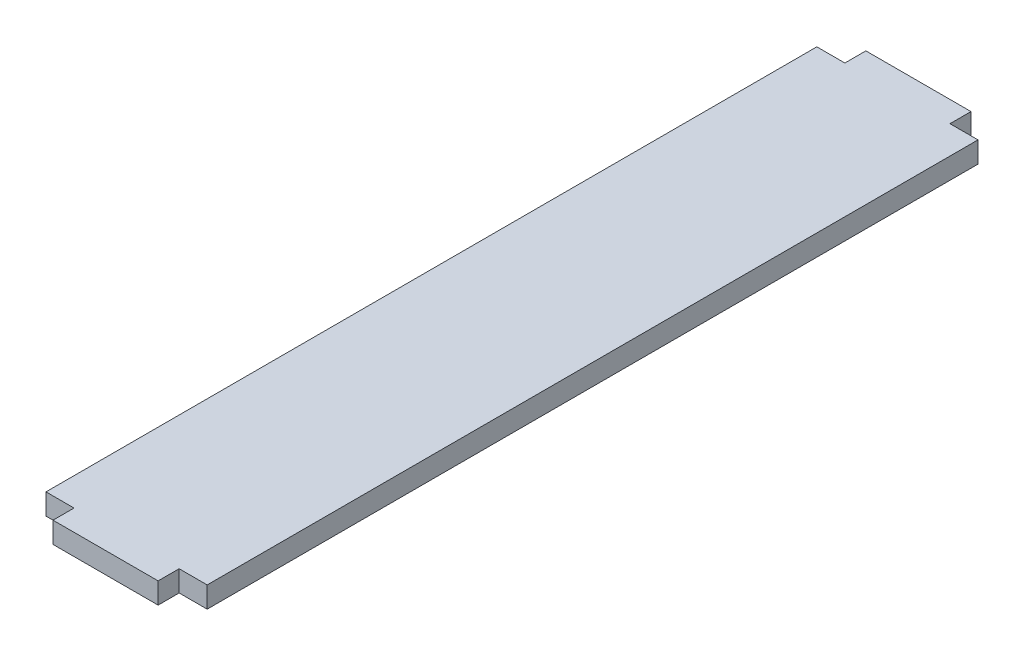
ISO-10303-21;
HEADER;
FILE_DESCRIPTION(('STEP AP214'),'2;1');
FILE_NAME('part.step','',(''),(''),'','','');
FILE_SCHEMA(('AUTOMOTIVE_DESIGN { 1 0 10303 214 1 1 1 1 }'));
ENDSEC;
DATA;
#1=APPLICATION_CONTEXT('core data for automotive mechanical design processes');
#2=APPLICATION_PROTOCOL_DEFINITION('international standard','automotive_design',2000,#1);
#3=PRODUCT_CONTEXT('',#1,'mechanical');
#4=PRODUCT('Part','Part','',(#3));
#5=PRODUCT_RELATED_PRODUCT_CATEGORY('part','',(#4));
#6=PRODUCT_DEFINITION_FORMATION('','',#4);
#7=PRODUCT_DEFINITION_CONTEXT('part definition',#1,'design');
#8=PRODUCT_DEFINITION('design','',#6,#7);
#9=PRODUCT_DEFINITION_SHAPE('','',#8);
#10=(LENGTH_UNIT() NAMED_UNIT(*) SI_UNIT(.MILLI.,.METRE.));
#11=(NAMED_UNIT(*) PLANE_ANGLE_UNIT() SI_UNIT($,.RADIAN.));
#12=(NAMED_UNIT(*) SI_UNIT($,.STERADIAN.) SOLID_ANGLE_UNIT());
#13=UNCERTAINTY_MEASURE_WITH_UNIT(LENGTH_MEASURE(1.E-05),#10,'distance_accuracy_value','');
#14=(GEOMETRIC_REPRESENTATION_CONTEXT(3) GLOBAL_UNCERTAINTY_ASSIGNED_CONTEXT((#13)) GLOBAL_UNIT_ASSIGNED_CONTEXT((#10,
#11,#12)) REPRESENTATION_CONTEXT('',''));
#15=CARTESIAN_POINT('',(0.,0.,0.));
#16=DIRECTION('',(0.,0.,1.));
#17=DIRECTION('',(1.,0.,0.));
#18=AXIS2_PLACEMENT_3D('',#15,#16,#17);
#19=CARTESIAN_POINT('',(3.75,1.5,-27.5));
#20=DIRECTION('',(0.,0.,1.));
#21=DIRECTION('',(1.,0.,0.));
#22=AXIS2_PLACEMENT_3D('',#19,#20,#21);
#23=PLANE('',#22);
#24=DIRECTION('',(-1.,0.,0.));
#25=VECTOR('',#24,1.);
#26=CARTESIAN_POINT('',(3.75,0.,-27.5));
#27=LINE('',#26,#25);
#28=CARTESIAN_POINT('',(5.75,0.,-27.5));
#29=VERTEX_POINT('',#28);
#30=CARTESIAN_POINT('',(3.75,0.,-27.5));
#31=VERTEX_POINT('',#30);
#32=EDGE_CURVE('E158',#29,#31,#27,.T.);
#33=ORIENTED_EDGE('',*,*,#32,.T.);
#34=DIRECTION('',(0.,-1.,0.));
#35=VECTOR('',#34,1.);
#36=CARTESIAN_POINT('',(3.75,1.5,-27.5));
#37=LINE('',#36,#35);
#38=CARTESIAN_POINT('',(3.75,1.5,-27.5));
#39=VERTEX_POINT('',#38);
#40=EDGE_CURVE('E41',#39,#31,#37,.T.);
#41=ORIENTED_EDGE('',*,*,#40,.F.);
#42=DIRECTION('',(-1.,0.,0.));
#43=VECTOR('',#42,1.);
#44=CARTESIAN_POINT('',(3.75,1.5,-27.5));
#45=LINE('',#44,#43);
#46=CARTESIAN_POINT('',(5.75,1.5,-27.5));
#47=VERTEX_POINT('',#46);
#48=EDGE_CURVE('E106',#47,#39,#45,.T.);
#49=ORIENTED_EDGE('',*,*,#48,.F.);
#50=DIRECTION('',(0.,-1.,0.));
#51=VECTOR('',#50,1.);
#52=CARTESIAN_POINT('',(5.75,1.5,-27.5));
#53=LINE('',#52,#51);
#54=EDGE_CURVE('E11',#47,#29,#53,.T.);
#55=ORIENTED_EDGE('',*,*,#54,.T.);
#56=EDGE_LOOP('',(#33,#41,#49,#55));
#57=FACE_BOUND('',#56,.T.);
#58=ADVANCED_FACE('F33',(#57),#23,.F.);
#59=CARTESIAN_POINT('',(3.75,1.5,-27.5));
#60=DIRECTION('',(-1.,0.,0.));
#61=DIRECTION('',(0.,0.,1.));
#62=AXIS2_PLACEMENT_3D('',#59,#60,#61);
#63=PLANE('',#62);
#64=DIRECTION('',(0.,0.,-1.));
#65=VECTOR('',#64,1.);
#66=CARTESIAN_POINT('',(3.75,0.,-27.5));
#67=LINE('',#66,#65);
#68=CARTESIAN_POINT('',(3.75,0.,-29.));
#69=VERTEX_POINT('',#68);
#70=EDGE_CURVE('E160',#31,#69,#67,.T.);
#71=ORIENTED_EDGE('',*,*,#70,.T.);
#72=DIRECTION('',(0.,-1.,0.));
#73=VECTOR('',#72,1.);
#74=CARTESIAN_POINT('',(3.75,1.5,-29.));
#75=LINE('',#74,#73);
#76=CARTESIAN_POINT('',(3.75,1.5,-29.));
#77=VERTEX_POINT('',#76);
#78=EDGE_CURVE('E198',#77,#69,#75,.T.);
#79=ORIENTED_EDGE('',*,*,#78,.F.);
#80=DIRECTION('',(0.,0.,-1.));
#81=VECTOR('',#80,1.);
#82=CARTESIAN_POINT('',(3.75,1.5,-27.5));
#83=LINE('',#82,#81);
#84=EDGE_CURVE('E206',#39,#77,#83,.T.);
#85=ORIENTED_EDGE('',*,*,#84,.F.);
#86=ORIENTED_EDGE('',*,*,#40,.T.);
#87=EDGE_LOOP('',(#71,#79,#85,#86));
#88=FACE_BOUND('',#87,.T.);
#89=ADVANCED_FACE('F204',(#88),#63,.F.);
#90=CARTESIAN_POINT('',(3.75,1.5,-29.));
#91=DIRECTION('',(0.,0.,1.));
#92=DIRECTION('',(1.,0.,0.));
#93=AXIS2_PLACEMENT_3D('',#90,#91,#92);
#94=PLANE('',#93);
#95=DIRECTION('',(-1.,0.,0.));
#96=VECTOR('',#95,1.);
#97=CARTESIAN_POINT('',(3.75,0.,-29.));
#98=LINE('',#97,#96);
#99=CARTESIAN_POINT('',(-3.75,0.,-29.));
#100=VERTEX_POINT('',#99);
#101=EDGE_CURVE('E162',#69,#100,#98,.T.);
#102=ORIENTED_EDGE('',*,*,#101,.T.);
#103=DIRECTION('',(0.,-1.,0.));
#104=VECTOR('',#103,1.);
#105=CARTESIAN_POINT('',(-3.75,1.5,-29.));
#106=LINE('',#105,#104);
#107=CARTESIAN_POINT('',(-3.75,1.5,-29.));
#108=VERTEX_POINT('',#107);
#109=EDGE_CURVE('E195',#108,#100,#106,.T.);
#110=ORIENTED_EDGE('',*,*,#109,.F.);
#111=DIRECTION('',(-1.,0.,0.));
#112=VECTOR('',#111,1.);
#113=CARTESIAN_POINT('',(3.75,1.5,-29.));
#114=LINE('',#113,#112);
#115=EDGE_CURVE('E222',#77,#108,#114,.T.);
#116=ORIENTED_EDGE('',*,*,#115,.F.);
#117=ORIENTED_EDGE('',*,*,#78,.T.);
#118=EDGE_LOOP('',(#102,#110,#116,#117));
#119=FACE_BOUND('',#118,.T.);
#120=ADVANCED_FACE('F213',(#119),#94,.F.);
#121=CARTESIAN_POINT('',(-3.75,1.5,-27.5));
#122=DIRECTION('',(1.,0.,0.));
#123=DIRECTION('',(0.,0.,-1.));
#124=AXIS2_PLACEMENT_3D('',#121,#122,#123);
#125=PLANE('',#124);
#126=DIRECTION('',(0.,0.,1.));
#127=VECTOR('',#126,1.);
#128=CARTESIAN_POINT('',(-3.75,0.,-27.5));
#129=LINE('',#128,#127);
#130=CARTESIAN_POINT('',(-3.75,0.,-27.5));
#131=VERTEX_POINT('',#130);
#132=EDGE_CURVE('E164',#100,#131,#129,.T.);
#133=ORIENTED_EDGE('',*,*,#132,.T.);
#134=DIRECTION('',(0.,-1.,0.));
#135=VECTOR('',#134,1.);
#136=CARTESIAN_POINT('',(-3.75,1.5,-27.5));
#137=LINE('',#136,#135);
#138=CARTESIAN_POINT('',(-3.75,1.5,-27.5));
#139=VERTEX_POINT('',#138);
#140=EDGE_CURVE('E192',#139,#131,#137,.T.);
#141=ORIENTED_EDGE('',*,*,#140,.F.);
#142=DIRECTION('',(0.,0.,1.));
#143=VECTOR('',#142,1.);
#144=CARTESIAN_POINT('',(-3.75,1.5,-27.5));
#145=LINE('',#144,#143);
#146=EDGE_CURVE('E219',#108,#139,#145,.T.);
#147=ORIENTED_EDGE('',*,*,#146,.F.);
#148=ORIENTED_EDGE('',*,*,#109,.T.);
#149=EDGE_LOOP('',(#133,#141,#147,#148));
#150=FACE_BOUND('',#149,.T.);
#151=ADVANCED_FACE('F217',(#150),#125,.F.);
#152=CARTESIAN_POINT('',(-5.75,1.5,-27.5));
#153=DIRECTION('',(0.,0.,1.));
#154=DIRECTION('',(1.,0.,0.));
#155=AXIS2_PLACEMENT_3D('',#152,#153,#154);
#156=PLANE('',#155);
#157=DIRECTION('',(-1.,0.,0.));
#158=VECTOR('',#157,1.);
#159=CARTESIAN_POINT('',(-5.75,0.,-27.5));
#160=LINE('',#159,#158);
#161=CARTESIAN_POINT('',(-5.75,0.,-27.5));
#162=VERTEX_POINT('',#161);
#163=EDGE_CURVE('E166',#131,#162,#160,.T.);
#164=ORIENTED_EDGE('',*,*,#163,.T.);
#165=DIRECTION('',(0.,-1.,0.));
#166=VECTOR('',#165,1.);
#167=CARTESIAN_POINT('',(-5.75,1.5,-27.5));
#168=LINE('',#167,#166);
#169=CARTESIAN_POINT('',(-5.75,1.5,-27.5));
#170=VERTEX_POINT('',#169);
#171=EDGE_CURVE('E189',#170,#162,#168,.T.);
#172=ORIENTED_EDGE('',*,*,#171,.F.);
#173=DIRECTION('',(-1.,0.,0.));
#174=VECTOR('',#173,1.);
#175=CARTESIAN_POINT('',(-5.75,1.5,-27.5));
#176=LINE('',#175,#174);
#177=EDGE_CURVE('E221',#139,#170,#176,.T.);
#178=ORIENTED_EDGE('',*,*,#177,.F.);
#179=ORIENTED_EDGE('',*,*,#140,.T.);
#180=EDGE_LOOP('',(#164,#172,#178,#179));
#181=FACE_BOUND('',#180,.T.);
#182=ADVANCED_FACE('F256',(#181),#156,.F.);
#183=CARTESIAN_POINT('',(-5.75,1.5,27.5));
#184=DIRECTION('',(1.,0.,0.));
#185=DIRECTION('',(0.,0.,-1.));
#186=AXIS2_PLACEMENT_3D('',#183,#184,#185);
#187=PLANE('',#186);
#188=DIRECTION('',(0.,0.,1.));
#189=VECTOR('',#188,1.);
#190=CARTESIAN_POINT('',(-5.75,0.,27.5));
#191=LINE('',#190,#189);
#192=CARTESIAN_POINT('',(-5.75,0.,27.5));
#193=VERTEX_POINT('',#192);
#194=EDGE_CURVE('E169',#162,#193,#191,.T.);
#195=ORIENTED_EDGE('',*,*,#194,.T.);
#196=DIRECTION('',(0.,-1.,0.));
#197=VECTOR('',#196,1.);
#198=CARTESIAN_POINT('',(-5.75,1.5,27.5));
#199=LINE('',#198,#197);
#200=CARTESIAN_POINT('',(-5.75,1.5,27.5));
#201=VERTEX_POINT('',#200);
#202=EDGE_CURVE('E186',#201,#193,#199,.T.);
#203=ORIENTED_EDGE('',*,*,#202,.F.);
#204=DIRECTION('',(0.,0.,1.));
#205=VECTOR('',#204,1.);
#206=CARTESIAN_POINT('',(-5.75,1.5,17.4000000000339));
#207=LINE('',#206,#205);
#208=EDGE_CURVE('E224',#170,#201,#207,.T.);
#209=ORIENTED_EDGE('',*,*,#208,.F.);
#210=ORIENTED_EDGE('',*,*,#171,.T.);
#211=EDGE_LOOP('',(#195,#203,#209,#210));
#212=FACE_BOUND('',#211,.T.);
#213=ADVANCED_FACE('F259',(#212),#187,.F.);
#214=CARTESIAN_POINT('',(-5.75,1.5,27.5));
#215=DIRECTION('',(0.,0.,-1.));
#216=DIRECTION('',(-1.,0.,0.));
#217=AXIS2_PLACEMENT_3D('',#214,#215,#216);
#218=PLANE('',#217);
#219=DIRECTION('',(1.,0.,0.));
#220=VECTOR('',#219,1.);
#221=CARTESIAN_POINT('',(-5.75,0.,27.5));
#222=LINE('',#221,#220);
#223=CARTESIAN_POINT('',(-3.75,0.,27.5));
#224=VERTEX_POINT('',#223);
#225=EDGE_CURVE('E171',#193,#224,#222,.T.);
#226=ORIENTED_EDGE('',*,*,#225,.T.);
#227=DIRECTION('',(0.,-1.,0.));
#228=VECTOR('',#227,1.);
#229=CARTESIAN_POINT('',(-3.75,1.5,27.5));
#230=LINE('',#229,#228);
#231=CARTESIAN_POINT('',(-3.75,1.5,27.5));
#232=VERTEX_POINT('',#231);
#233=EDGE_CURVE('E183',#232,#224,#230,.T.);
#234=ORIENTED_EDGE('',*,*,#233,.F.);
#235=DIRECTION('',(1.,0.,0.));
#236=VECTOR('',#235,1.);
#237=CARTESIAN_POINT('',(-5.75,1.5,27.5));
#238=LINE('',#237,#236);
#239=EDGE_CURVE('E230',#201,#232,#238,.T.);
#240=ORIENTED_EDGE('',*,*,#239,.F.);
#241=ORIENTED_EDGE('',*,*,#202,.T.);
#242=EDGE_LOOP('',(#226,#234,#240,#241));
#243=FACE_BOUND('',#242,.T.);
#244=ADVANCED_FACE('F236',(#243),#218,.F.);
#245=CARTESIAN_POINT('',(-3.75,1.5,27.5));
#246=DIRECTION('',(1.,0.,0.));
#247=DIRECTION('',(0.,0.,-1.));
#248=AXIS2_PLACEMENT_3D('',#245,#246,#247);
#249=PLANE('',#248);
#250=DIRECTION('',(0.,0.,1.));
#251=VECTOR('',#250,1.);
#252=CARTESIAN_POINT('',(-3.75,0.,27.5));
#253=LINE('',#252,#251);
#254=CARTESIAN_POINT('',(-3.75,0.,29.));
#255=VERTEX_POINT('',#254);
#256=EDGE_CURVE('E173',#224,#255,#253,.T.);
#257=ORIENTED_EDGE('',*,*,#256,.T.);
#258=DIRECTION('',(0.,-1.,0.));
#259=VECTOR('',#258,1.);
#260=CARTESIAN_POINT('',(-3.75,1.5,29.));
#261=LINE('',#260,#259);
#262=CARTESIAN_POINT('',(-3.75,1.5,29.));
#263=VERTEX_POINT('',#262);
#264=EDGE_CURVE('E147',#263,#255,#261,.T.);
#265=ORIENTED_EDGE('',*,*,#264,.F.);
#266=DIRECTION('',(0.,0.,1.));
#267=VECTOR('',#266,1.);
#268=CARTESIAN_POINT('',(-3.75,1.5,27.5));
#269=LINE('',#268,#267);
#270=EDGE_CURVE('E138',#232,#263,#269,.T.);
#271=ORIENTED_EDGE('',*,*,#270,.F.);
#272=ORIENTED_EDGE('',*,*,#233,.T.);
#273=EDGE_LOOP('',(#257,#265,#271,#272));
#274=FACE_BOUND('',#273,.T.);
#275=ADVANCED_FACE('F240',(#274),#249,.F.);
#276=CARTESIAN_POINT('',(-3.75,1.5,29.));
#277=DIRECTION('',(0.,0.,-1.));
#278=DIRECTION('',(-1.,0.,0.));
#279=AXIS2_PLACEMENT_3D('',#276,#277,#278);
#280=PLANE('',#279);
#281=DIRECTION('',(1.,0.,0.));
#282=VECTOR('',#281,1.);
#283=CARTESIAN_POINT('',(-3.75,0.,29.));
#284=LINE('',#283,#282);
#285=CARTESIAN_POINT('',(3.75,0.,29.));
#286=VERTEX_POINT('',#285);
#287=EDGE_CURVE('E146',#255,#286,#284,.T.);
#288=ORIENTED_EDGE('',*,*,#287,.T.);
#289=DIRECTION('',(0.,-1.,0.));
#290=VECTOR('',#289,1.);
#291=CARTESIAN_POINT('',(3.75,1.5,29.));
#292=LINE('',#291,#290);
#293=CARTESIAN_POINT('',(3.75,1.5,29.));
#294=VERTEX_POINT('',#293);
#295=EDGE_CURVE('E143',#294,#286,#292,.T.);
#296=ORIENTED_EDGE('',*,*,#295,.F.);
#297=DIRECTION('',(1.,0.,0.));
#298=VECTOR('',#297,1.);
#299=CARTESIAN_POINT('',(-3.75,1.5,29.));
#300=LINE('',#299,#298);
#301=EDGE_CURVE('E132',#263,#294,#300,.T.);
#302=ORIENTED_EDGE('',*,*,#301,.F.);
#303=ORIENTED_EDGE('',*,*,#264,.T.);
#304=EDGE_LOOP('',(#288,#296,#302,#303));
#305=FACE_BOUND('',#304,.T.);
#306=ADVANCED_FACE('F144',(#305),#280,.F.);
#307=CARTESIAN_POINT('',(3.75,1.5,27.5));
#308=DIRECTION('',(-1.,0.,0.));
#309=DIRECTION('',(0.,0.,1.));
#310=AXIS2_PLACEMENT_3D('',#307,#308,#309);
#311=PLANE('',#310);
#312=DIRECTION('',(0.,0.,-1.));
#313=VECTOR('',#312,1.);
#314=CARTESIAN_POINT('',(3.75,0.,27.5));
#315=LINE('',#314,#313);
#316=CARTESIAN_POINT('',(3.75,0.,27.5));
#317=VERTEX_POINT('',#316);
#318=EDGE_CURVE('E91',#286,#317,#315,.T.);
#319=ORIENTED_EDGE('',*,*,#318,.T.);
#320=DIRECTION('',(0.,-1.,0.));
#321=VECTOR('',#320,1.);
#322=CARTESIAN_POINT('',(3.75,1.5,27.5));
#323=LINE('',#322,#321);
#324=CARTESIAN_POINT('',(3.75,1.5,27.5));
#325=VERTEX_POINT('',#324);
#326=EDGE_CURVE('E148',#325,#317,#323,.T.);
#327=ORIENTED_EDGE('',*,*,#326,.F.);
#328=DIRECTION('',(0.,0.,-1.));
#329=VECTOR('',#328,1.);
#330=CARTESIAN_POINT('',(3.75,1.5,27.5));
#331=LINE('',#330,#329);
#332=EDGE_CURVE('E136',#294,#325,#331,.T.);
#333=ORIENTED_EDGE('',*,*,#332,.F.);
#334=ORIENTED_EDGE('',*,*,#295,.T.);
#335=EDGE_LOOP('',(#319,#327,#333,#334));
#336=FACE_BOUND('',#335,.T.);
#337=ADVANCED_FACE('F150',(#336),#311,.F.);
#338=CARTESIAN_POINT('',(3.75,1.5,27.5));
#339=DIRECTION('',(0.,0.,-1.));
#340=DIRECTION('',(-1.,0.,0.));
#341=AXIS2_PLACEMENT_3D('',#338,#339,#340);
#342=PLANE('',#341);
#343=DIRECTION('',(1.,0.,0.));
#344=VECTOR('',#343,1.);
#345=CARTESIAN_POINT('',(3.75,0.,27.5));
#346=LINE('',#345,#344);
#347=CARTESIAN_POINT('',(5.75,0.,27.5));
#348=VERTEX_POINT('',#347);
#349=EDGE_CURVE('E177',#317,#348,#346,.T.);
#350=ORIENTED_EDGE('',*,*,#349,.T.);
#351=DIRECTION('',(0.,-1.,0.));
#352=VECTOR('',#351,1.);
#353=CARTESIAN_POINT('',(5.75,1.5,27.5));
#354=LINE('',#353,#352);
#355=CARTESIAN_POINT('',(5.75,1.5,27.5));
#356=VERTEX_POINT('',#355);
#357=EDGE_CURVE('E154',#356,#348,#354,.T.);
#358=ORIENTED_EDGE('',*,*,#357,.F.);
#359=DIRECTION('',(1.,0.,0.));
#360=VECTOR('',#359,1.);
#361=CARTESIAN_POINT('',(3.75,1.5,27.5));
#362=LINE('',#361,#360);
#363=EDGE_CURVE('E152',#325,#356,#362,.T.);
#364=ORIENTED_EDGE('',*,*,#363,.F.);
#365=ORIENTED_EDGE('',*,*,#326,.T.);
#366=EDGE_LOOP('',(#350,#358,#364,#365));
#367=FACE_BOUND('',#366,.T.);
#368=ADVANCED_FACE('F243',(#367),#342,.F.);
#369=CARTESIAN_POINT('',(5.75,1.5,14.1000000000343));
#370=DIRECTION('',(-1.,0.,0.));
#371=DIRECTION('',(0.,0.,1.));
#372=AXIS2_PLACEMENT_3D('',#369,#370,#371);
#373=PLANE('',#372);
#374=DIRECTION('',(0.,0.,-1.));
#375=VECTOR('',#374,1.);
#376=CARTESIAN_POINT('',(5.75,0.,14.1000000000343));
#377=LINE('',#376,#375);
#378=EDGE_CURVE('E98',#348,#29,#377,.T.);
#379=ORIENTED_EDGE('',*,*,#378,.T.);
#380=ORIENTED_EDGE('',*,*,#54,.F.);
#381=DIRECTION('',(0.,0.,-1.));
#382=VECTOR('',#381,1.);
#383=CARTESIAN_POINT('',(5.75,1.5,12.4000000000339));
#384=LINE('',#383,#382);
#385=EDGE_CURVE('E49',#356,#47,#384,.T.);
#386=ORIENTED_EDGE('',*,*,#385,.F.);
#387=ORIENTED_EDGE('',*,*,#357,.T.);
#388=EDGE_LOOP('',(#379,#380,#386,#387));
#389=FACE_BOUND('',#388,.T.);
#390=ADVANCED_FACE('F244',(#389),#373,.F.);
#391=CARTESIAN_POINT('',(0.,1.5,0.));
#392=DIRECTION('',(0.,-1.,0.));
#393=DIRECTION('',(0.,0.,-1.));
#394=AXIS2_PLACEMENT_3D('',#391,#392,#393);
#395=PLANE('',#394);
#396=ORIENTED_EDGE('',*,*,#385,.T.);
#397=ORIENTED_EDGE('',*,*,#48,.T.);
#398=ORIENTED_EDGE('',*,*,#84,.T.);
#399=ORIENTED_EDGE('',*,*,#115,.T.);
#400=ORIENTED_EDGE('',*,*,#146,.T.);
#401=ORIENTED_EDGE('',*,*,#177,.T.);
#402=ORIENTED_EDGE('',*,*,#208,.T.);
#403=ORIENTED_EDGE('',*,*,#239,.T.);
#404=ORIENTED_EDGE('',*,*,#270,.T.);
#405=ORIENTED_EDGE('',*,*,#301,.T.);
#406=ORIENTED_EDGE('',*,*,#332,.T.);
#407=ORIENTED_EDGE('',*,*,#363,.T.);
#408=EDGE_LOOP('',(#396,#397,#398,#399,#400,#401,#402,#403,#404,#405,#406,#407));
#409=FACE_BOUND('',#408,.T.);
#410=ADVANCED_FACE('F134',(#409),#395,.F.);
#411=CARTESIAN_POINT('',(0.,0.,0.));
#412=DIRECTION('',(0.,-1.,0.));
#413=DIRECTION('',(0.,0.,-1.));
#414=AXIS2_PLACEMENT_3D('',#411,#412,#413);
#415=PLANE('',#414);
#416=ORIENTED_EDGE('',*,*,#32,.F.);
#417=ORIENTED_EDGE('',*,*,#378,.F.);
#418=ORIENTED_EDGE('',*,*,#349,.F.);
#419=ORIENTED_EDGE('',*,*,#318,.F.);
#420=ORIENTED_EDGE('',*,*,#287,.F.);
#421=ORIENTED_EDGE('',*,*,#256,.F.);
#422=ORIENTED_EDGE('',*,*,#225,.F.);
#423=ORIENTED_EDGE('',*,*,#194,.F.);
#424=ORIENTED_EDGE('',*,*,#163,.F.);
#425=ORIENTED_EDGE('',*,*,#132,.F.);
#426=ORIENTED_EDGE('',*,*,#101,.F.);
#427=ORIENTED_EDGE('',*,*,#70,.F.);
#428=EDGE_LOOP('',(#416,#417,#418,#419,#420,#421,#422,#423,#424,#425,#426,#427));
#429=FACE_BOUND('',#428,.T.);
#430=ADVANCED_FACE('F208',(#429),#415,.T.);
#431=CLOSED_SHELL('',(#58,#89,#120,#151,#182,#213,#244,#275,#306,#337,#368,#390,#410,#430));
#432=MANIFOLD_SOLID_BREP('B2',#431);
#433=ADVANCED_BREP_SHAPE_REPRESENTATION('',(#18,#432),#14);
#434=SHAPE_DEFINITION_REPRESENTATION(#9,#433);
ENDSEC;
END-ISO-10303-21;
